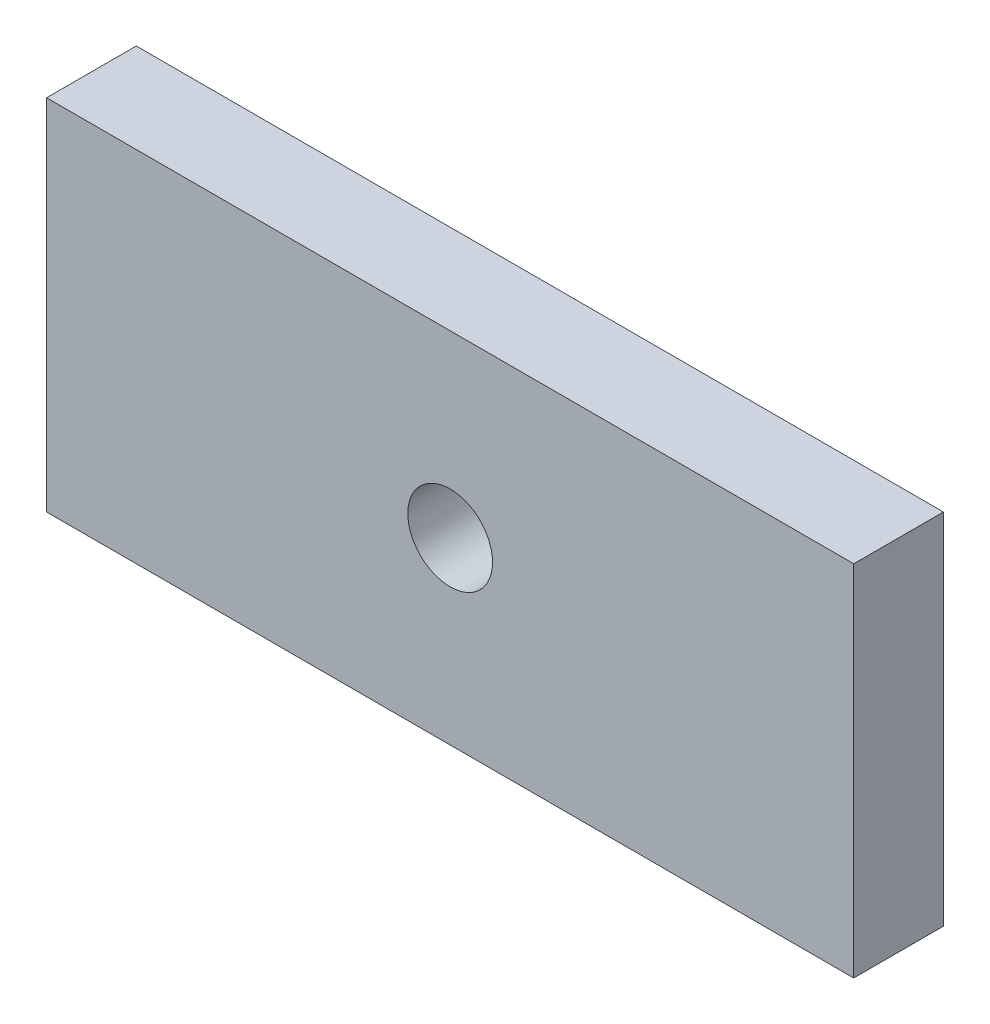
ISO-10303-21;
HEADER;
FILE_DESCRIPTION(('STEP AP214'),'2;1');
FILE_NAME('part.step','',(''),(''),'','','');
FILE_SCHEMA(('AUTOMOTIVE_DESIGN { 1 0 10303 214 1 1 1 1 }'));
ENDSEC;
DATA;
#1=APPLICATION_CONTEXT('core data for automotive mechanical design processes');
#2=APPLICATION_PROTOCOL_DEFINITION('international standard','automotive_design',2000,#1);
#3=PRODUCT_CONTEXT('',#1,'mechanical');
#4=PRODUCT('Part','Part','',(#3));
#5=PRODUCT_RELATED_PRODUCT_CATEGORY('part','',(#4));
#6=PRODUCT_DEFINITION_FORMATION('','',#4);
#7=PRODUCT_DEFINITION_CONTEXT('part definition',#1,'design');
#8=PRODUCT_DEFINITION('design','',#6,#7);
#9=PRODUCT_DEFINITION_SHAPE('','',#8);
#10=(LENGTH_UNIT() NAMED_UNIT(*) SI_UNIT(.MILLI.,.METRE.));
#11=(NAMED_UNIT(*) PLANE_ANGLE_UNIT() SI_UNIT($,.RADIAN.));
#12=(NAMED_UNIT(*) SI_UNIT($,.STERADIAN.) SOLID_ANGLE_UNIT());
#13=UNCERTAINTY_MEASURE_WITH_UNIT(LENGTH_MEASURE(1.E-05),#10,'distance_accuracy_value','');
#14=(GEOMETRIC_REPRESENTATION_CONTEXT(3) GLOBAL_UNCERTAINTY_ASSIGNED_CONTEXT((#13)) GLOBAL_UNIT_ASSIGNED_CONTEXT((#10,
#11,#12)) REPRESENTATION_CONTEXT('',''));
#15=CARTESIAN_POINT('',(0.,0.,0.));
#16=DIRECTION('',(0.,0.,1.));
#17=DIRECTION('',(1.,0.,0.));
#18=AXIS2_PLACEMENT_3D('',#15,#16,#17);
#19=CARTESIAN_POINT('',(0.,0.,12.7));
#20=DIRECTION('',(0.,0.,-1.));
#21=DIRECTION('',(-1.,0.,0.));
#22=AXIS2_PLACEMENT_3D('',#19,#20,#21);
#23=PLANE('',#22);
#24=DIRECTION('',(0.,-1.,0.));
#25=VECTOR('',#24,1.);
#26=CARTESIAN_POINT('',(0.,0.,12.7));
#27=LINE('',#26,#25);
#28=CARTESIAN_POINT('',(0.,50.8,12.7));
#29=VERTEX_POINT('',#28);
#30=CARTESIAN_POINT('',(0.,0.,12.7));
#31=VERTEX_POINT('',#30);
#32=EDGE_CURVE('E84',#29,#31,#27,.T.);
#33=ORIENTED_EDGE('',*,*,#32,.T.);
#34=DIRECTION('',(1.,0.,0.));
#35=VECTOR('',#34,1.);
#36=CARTESIAN_POINT('',(0.,0.,12.7));
#37=LINE('',#36,#35);
#38=CARTESIAN_POINT('',(114.3,0.,12.7));
#39=VERTEX_POINT('',#38);
#40=EDGE_CURVE('E79',#31,#39,#37,.T.);
#41=ORIENTED_EDGE('',*,*,#40,.T.);
#42=DIRECTION('',(0.,1.,0.));
#43=VECTOR('',#42,1.);
#44=CARTESIAN_POINT('',(114.3,0.,12.7));
#45=LINE('',#44,#43);
#46=CARTESIAN_POINT('',(114.3,50.8,12.7));
#47=VERTEX_POINT('',#46);
#48=EDGE_CURVE('E82',#39,#47,#45,.T.);
#49=ORIENTED_EDGE('',*,*,#48,.T.);
#50=DIRECTION('',(-1.,0.,0.));
#51=VECTOR('',#50,1.);
#52=CARTESIAN_POINT('',(0.,50.8,12.7));
#53=LINE('',#52,#51);
#54=EDGE_CURVE('E49',#47,#29,#53,.T.);
#55=ORIENTED_EDGE('',*,*,#54,.T.);
#56=EDGE_LOOP('',(#33,#41,#49,#55));
#57=FACE_BOUND('',#56,.T.);
#58=CARTESIAN_POINT('',(57.15,25.4,12.7));
#59=DIRECTION('',(0.,0.,1.));
#60=DIRECTION('',(1.,0.,0.));
#61=AXIS2_PLACEMENT_3D('',#58,#59,#60);
#62=CIRCLE('',#61,5.99999999999999);
#63=CARTESIAN_POINT('',(63.15,25.4,12.7));
#64=VERTEX_POINT('',#63);
#65=EDGE_CURVE('E99',#64,#64,#62,.T.);
#66=ORIENTED_EDGE('',*,*,#65,.F.);
#67=EDGE_LOOP('',(#66));
#68=FACE_BOUND('',#67,.T.);
#69=ADVANCED_FACE('F32',(#57,#68),#23,.F.);
#70=CARTESIAN_POINT('',(0.,0.,0.));
#71=DIRECTION('',(0.,0.,-1.));
#72=DIRECTION('',(-1.,0.,0.));
#73=AXIS2_PLACEMENT_3D('',#70,#71,#72);
#74=PLANE('',#73);
#75=DIRECTION('',(0.,-1.,0.));
#76=VECTOR('',#75,1.);
#77=CARTESIAN_POINT('',(0.,0.,0.));
#78=LINE('',#77,#76);
#79=CARTESIAN_POINT('',(0.,50.8,0.));
#80=VERTEX_POINT('',#79);
#81=CARTESIAN_POINT('',(0.,0.,0.));
#82=VERTEX_POINT('',#81);
#83=EDGE_CURVE('E96',#80,#82,#78,.T.);
#84=ORIENTED_EDGE('',*,*,#83,.F.);
#85=DIRECTION('',(-1.,0.,0.));
#86=VECTOR('',#85,1.);
#87=CARTESIAN_POINT('',(0.,50.8,0.));
#88=LINE('',#87,#86);
#89=CARTESIAN_POINT('',(114.3,50.8,0.));
#90=VERTEX_POINT('',#89);
#91=EDGE_CURVE('E72',#90,#80,#88,.T.);
#92=ORIENTED_EDGE('',*,*,#91,.F.);
#93=DIRECTION('',(0.,1.,0.));
#94=VECTOR('',#93,1.);
#95=CARTESIAN_POINT('',(114.3,0.,0.));
#96=LINE('',#95,#94);
#97=CARTESIAN_POINT('',(114.3,0.,0.));
#98=VERTEX_POINT('',#97);
#99=EDGE_CURVE('E66',#98,#90,#96,.T.);
#100=ORIENTED_EDGE('',*,*,#99,.F.);
#101=DIRECTION('',(1.,0.,0.));
#102=VECTOR('',#101,1.);
#103=CARTESIAN_POINT('',(0.,0.,0.));
#104=LINE('',#103,#102);
#105=EDGE_CURVE('E88',#82,#98,#104,.T.);
#106=ORIENTED_EDGE('',*,*,#105,.F.);
#107=EDGE_LOOP('',(#84,#92,#100,#106));
#108=FACE_BOUND('',#107,.T.);
#109=CARTESIAN_POINT('',(57.15,25.4,0.));
#110=DIRECTION('',(0.,0.,1.));
#111=DIRECTION('',(1.,0.,0.));
#112=AXIS2_PLACEMENT_3D('',#109,#110,#111);
#113=CIRCLE('',#112,5.99999999999999);
#114=CARTESIAN_POINT('',(63.15,25.4,0.));
#115=VERTEX_POINT('',#114);
#116=EDGE_CURVE('E111',#115,#115,#113,.T.);
#117=ORIENTED_EDGE('',*,*,#116,.T.);
#118=EDGE_LOOP('',(#117));
#119=FACE_BOUND('',#118,.T.);
#120=ADVANCED_FACE('F107',(#108,#119),#74,.T.);
#121=CARTESIAN_POINT('',(0.,0.,12.7));
#122=DIRECTION('',(1.,0.,0.));
#123=DIRECTION('',(0.,0.,-1.));
#124=AXIS2_PLACEMENT_3D('',#121,#122,#123);
#125=PLANE('',#124);
#126=ORIENTED_EDGE('',*,*,#83,.T.);
#127=DIRECTION('',(0.,0.,-1.));
#128=VECTOR('',#127,1.);
#129=CARTESIAN_POINT('',(0.,0.,12.7));
#130=LINE('',#129,#128);
#131=EDGE_CURVE('E11',#31,#82,#130,.T.);
#132=ORIENTED_EDGE('',*,*,#131,.F.);
#133=ORIENTED_EDGE('',*,*,#32,.F.);
#134=DIRECTION('',(0.,0.,-1.));
#135=VECTOR('',#134,1.);
#136=CARTESIAN_POINT('',(0.,50.8,12.7));
#137=LINE('',#136,#135);
#138=EDGE_CURVE('E92',#29,#80,#137,.T.);
#139=ORIENTED_EDGE('',*,*,#138,.T.);
#140=EDGE_LOOP('',(#126,#132,#133,#139));
#141=FACE_BOUND('',#140,.T.);
#142=ADVANCED_FACE('F34',(#141),#125,.F.);
#143=CARTESIAN_POINT('',(0.,0.,12.7));
#144=DIRECTION('',(0.,1.,0.));
#145=DIRECTION('',(0.,0.,1.));
#146=AXIS2_PLACEMENT_3D('',#143,#144,#145);
#147=PLANE('',#146);
#148=ORIENTED_EDGE('',*,*,#105,.T.);
#149=DIRECTION('',(0.,0.,-1.));
#150=VECTOR('',#149,1.);
#151=CARTESIAN_POINT('',(114.3,0.,12.7));
#152=LINE('',#151,#150);
#153=EDGE_CURVE('E41',#39,#98,#152,.T.);
#154=ORIENTED_EDGE('',*,*,#153,.F.);
#155=ORIENTED_EDGE('',*,*,#40,.F.);
#156=ORIENTED_EDGE('',*,*,#131,.T.);
#157=EDGE_LOOP('',(#148,#154,#155,#156));
#158=FACE_BOUND('',#157,.T.);
#159=ADVANCED_FACE('F87',(#158),#147,.F.);
#160=CARTESIAN_POINT('',(114.3,0.,12.7));
#161=DIRECTION('',(-1.,0.,0.));
#162=DIRECTION('',(0.,0.,1.));
#163=AXIS2_PLACEMENT_3D('',#160,#161,#162);
#164=PLANE('',#163);
#165=ORIENTED_EDGE('',*,*,#99,.T.);
#166=DIRECTION('',(0.,0.,-1.));
#167=VECTOR('',#166,1.);
#168=CARTESIAN_POINT('',(114.3,50.8,12.7));
#169=LINE('',#168,#167);
#170=EDGE_CURVE('E89',#47,#90,#169,.T.);
#171=ORIENTED_EDGE('',*,*,#170,.F.);
#172=ORIENTED_EDGE('',*,*,#48,.F.);
#173=ORIENTED_EDGE('',*,*,#153,.T.);
#174=EDGE_LOOP('',(#165,#171,#172,#173));
#175=FACE_BOUND('',#174,.T.);
#176=ADVANCED_FACE('F90',(#175),#164,.F.);
#177=CARTESIAN_POINT('',(0.,50.8,12.7));
#178=DIRECTION('',(0.,-1.,0.));
#179=DIRECTION('',(0.,0.,-1.));
#180=AXIS2_PLACEMENT_3D('',#177,#178,#179);
#181=PLANE('',#180);
#182=ORIENTED_EDGE('',*,*,#91,.T.);
#183=ORIENTED_EDGE('',*,*,#138,.F.);
#184=ORIENTED_EDGE('',*,*,#54,.F.);
#185=ORIENTED_EDGE('',*,*,#170,.T.);
#186=EDGE_LOOP('',(#182,#183,#184,#185));
#187=FACE_BOUND('',#186,.T.);
#188=ADVANCED_FACE('F104',(#187),#181,.F.);
#189=CARTESIAN_POINT('',(57.15,25.4,12.7));
#190=DIRECTION('',(0.,0.,-1.));
#191=DIRECTION('',(-1.,0.,0.));
#192=AXIS2_PLACEMENT_3D('',#189,#190,#191);
#193=CYLINDRICAL_SURFACE('',#192,5.99999999999999);
#194=ORIENTED_EDGE('',*,*,#65,.T.);
#195=EDGE_LOOP('',(#194));
#196=FACE_BOUND('',#195,.T.);
#197=ORIENTED_EDGE('',*,*,#116,.F.);
#198=EDGE_LOOP('',(#197));
#199=FACE_BOUND('',#198,.T.);
#200=ADVANCED_FACE('F117',(#196,#199),#193,.F.);
#201=CLOSED_SHELL('',(#69,#120,#142,#159,#176,#188,#200));
#202=MANIFOLD_SOLID_BREP('B2',#201);
#203=ADVANCED_BREP_SHAPE_REPRESENTATION('',(#18,#202),#14);
#204=SHAPE_DEFINITION_REPRESENTATION(#9,#203);
ENDSEC;
END-ISO-10303-21;
